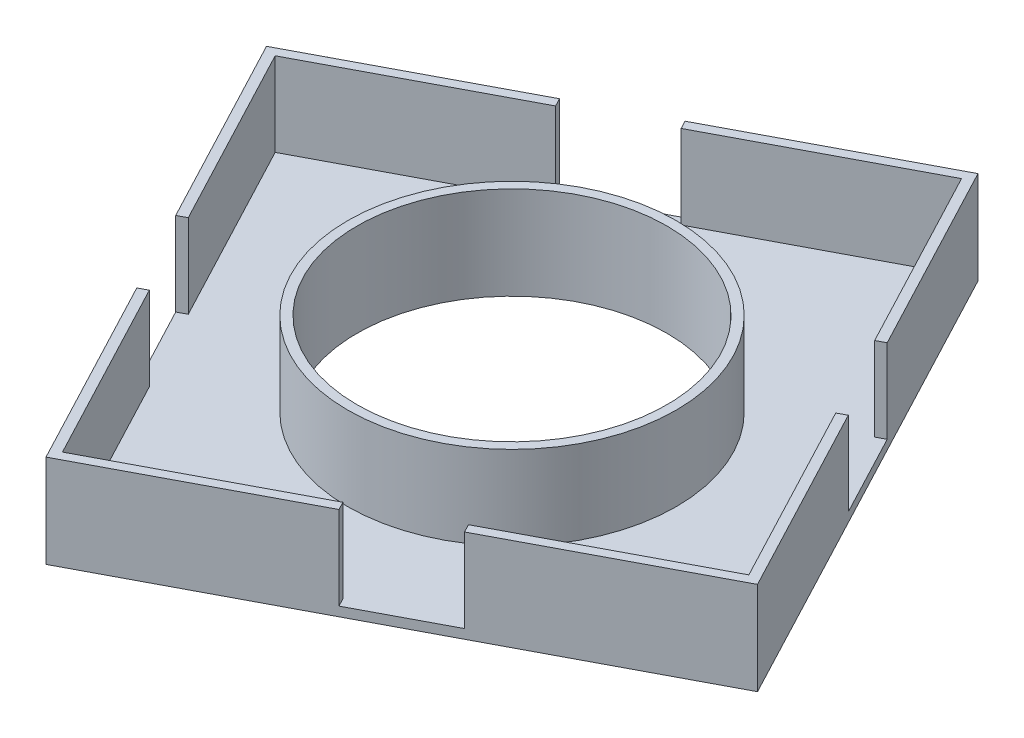
ISO-10303-21;
HEADER;
FILE_DESCRIPTION(('STEP AP214'),'2;1');
FILE_NAME('part.step','',(''),(''),'','','');
FILE_SCHEMA(('AUTOMOTIVE_DESIGN { 1 0 10303 214 1 1 1 1 }'));
ENDSEC;
DATA;
#1=APPLICATION_CONTEXT('core data for automotive mechanical design processes');
#2=APPLICATION_PROTOCOL_DEFINITION('international standard','automotive_design',2000,#1);
#3=PRODUCT_CONTEXT('',#1,'mechanical');
#4=PRODUCT('Part','Part','',(#3));
#5=PRODUCT_RELATED_PRODUCT_CATEGORY('part','',(#4));
#6=PRODUCT_DEFINITION_FORMATION('','',#4);
#7=PRODUCT_DEFINITION_CONTEXT('part definition',#1,'design');
#8=PRODUCT_DEFINITION('design','',#6,#7);
#9=PRODUCT_DEFINITION_SHAPE('','',#8);
#10=(LENGTH_UNIT() NAMED_UNIT(*) SI_UNIT(.MILLI.,.METRE.));
#11=(NAMED_UNIT(*) PLANE_ANGLE_UNIT() SI_UNIT($,.RADIAN.));
#12=(NAMED_UNIT(*) SI_UNIT($,.STERADIAN.) SOLID_ANGLE_UNIT());
#13=UNCERTAINTY_MEASURE_WITH_UNIT(LENGTH_MEASURE(1.E-05),#10,'distance_accuracy_value','');
#14=(GEOMETRIC_REPRESENTATION_CONTEXT(3) GLOBAL_UNCERTAINTY_ASSIGNED_CONTEXT((#13)) GLOBAL_UNIT_ASSIGNED_CONTEXT((#10,
#11,#12)) REPRESENTATION_CONTEXT('',''));
#15=CARTESIAN_POINT('',(0.,0.,0.));
#16=DIRECTION('',(0.,0.,1.));
#17=DIRECTION('',(1.,0.,0.));
#18=AXIS2_PLACEMENT_3D('',#15,#16,#17);
#19=CARTESIAN_POINT('',(0.,30.,0.));
#20=DIRECTION('',(0.,1.,0.));
#21=DIRECTION('',(0.,0.,1.));
#22=AXIS2_PLACEMENT_3D('',#19,#20,#21);
#23=PLANE('',#22);
#24=DIRECTION('',(0.466105526210317,0.,0.884729132806309));
#25=VECTOR('',#24,1.);
#26=CARTESIAN_POINT('',(24.9497161571522,30.,79.539371783273));
#27=LINE('',#26,#25);
#28=CARTESIAN_POINT('',(24.9497161571522,30.,79.539371783273));
#29=VERTEX_POINT('',#28);
#30=CARTESIAN_POINT('',(26.3480327357832,30.,82.193559181692));
#31=VERTEX_POINT('',#30);
#32=EDGE_CURVE('E212',#29,#31,#27,.T.);
#33=ORIENTED_EDGE('',*,*,#32,.F.);
#34=DIRECTION('',(0.884729132806305,0.,-0.466105526210324));
#35=VECTOR('',#34,1.);
#36=CARTESIAN_POINT('',(-36.9813231392899,30.,112.166758617996));
#37=LINE('',#36,#35);
#38=CARTESIAN_POINT('',(-34.327135740871,30.,110.768442039365));
#39=VERTEX_POINT('',#38);
#40=EDGE_CURVE('E332',#39,#29,#37,.T.);
#41=ORIENTED_EDGE('',*,*,#40,.F.);
#42=DIRECTION('',(0.466105526210324,0.,0.884729132806305));
#43=VECTOR('',#42,1.);
#44=CARTESIAN_POINT('',(-112.166758617996,30.,-36.9813231392899));
#45=LINE('',#44,#43);
#46=CARTESIAN_POINT('',(-65.5562059969636,30.,51.4915901413412));
#47=VERTEX_POINT('',#46);
#48=EDGE_CURVE('E344',#47,#39,#45,.T.);
#49=ORIENTED_EDGE('',*,*,#48,.F.);
#50=DIRECTION('',(0.88472913280631,0.,-0.466105526210316));
#51=VECTOR('',#50,1.);
#52=CARTESIAN_POINT('',(-68.2103933953825,30.,52.8899067199722));
#53=LINE('',#52,#51);
#54=CARTESIAN_POINT('',(-68.2103933953825,30.,52.8899067199722));
#55=VERTEX_POINT('',#54);
#56=EDGE_CURVE('E250',#55,#47,#53,.T.);
#57=ORIENTED_EDGE('',*,*,#56,.F.);
#58=DIRECTION('',(0.466105526210324,0.,0.884729132806305));
#59=VECTOR('',#58,1.);
#60=CARTESIAN_POINT('',(-114.820946016415,30.,-35.5830065606589));
#61=LINE('',#60,#59);
#62=CARTESIAN_POINT('',(-35.5830065606589,30.,114.820946016415));
#63=VERTEX_POINT('',#62);
#64=EDGE_CURVE('E367',#55,#63,#61,.T.);
#65=ORIENTED_EDGE('',*,*,#64,.T.);
#66=DIRECTION('',(0.884729132806305,0.,-0.466105526210324));
#67=VECTOR('',#66,1.);
#68=CARTESIAN_POINT('',(-35.5830065606589,30.,114.820946016415));
#69=LINE('',#68,#67);
#70=EDGE_CURVE('E372',#63,#31,#69,.T.);
#71=ORIENTED_EDGE('',*,*,#70,.T.);
#72=EDGE_LOOP('',(#33,#41,#49,#57,#65,#71));
#73=FACE_BOUND('',#72,.T.);
#74=ADVANCED_FACE('F47',(#73),#23,.T.);
#75=DIRECTION('',(-0.884729132806309,0.,0.466105526210317));
#76=VECTOR('',#75,1.);
#77=CARTESIAN_POINT('',(-79.5393717832731,30.,24.949716157152));
#78=LINE('',#77,#76);
#79=CARTESIAN_POINT('',(-79.5393717832731,30.,24.949716157152));
#80=VERTEX_POINT('',#79);
#81=CARTESIAN_POINT('',(-82.193559181692,30.,26.3480327357829));
#82=VERTEX_POINT('',#81);
#83=EDGE_CURVE('E254',#80,#82,#78,.T.);
#84=ORIENTED_EDGE('',*,*,#83,.F.);
#85=CARTESIAN_POINT('',(-110.768442039365,30.,-34.327135740871));
#86=VERTEX_POINT('',#85);
#87=EDGE_CURVE('E345',#86,#80,#45,.T.);
#88=ORIENTED_EDGE('',*,*,#87,.F.);
#89=DIRECTION('',(-0.884729132806305,0.,0.466105526210324));
#90=VECTOR('',#89,1.);
#91=CARTESIAN_POINT('',(36.9813231392899,30.,-112.166758617996));
#92=LINE('',#91,#90);
#93=CARTESIAN_POINT('',(-51.491590141341,30.,-65.5562059969637));
#94=VERTEX_POINT('',#93);
#95=EDGE_CURVE('E340',#94,#86,#92,.T.);
#96=ORIENTED_EDGE('',*,*,#95,.F.);
#97=DIRECTION('',(0.466105526210314,0.,0.88472913280631));
#98=VECTOR('',#97,1.);
#99=CARTESIAN_POINT('',(-52.8899067199719,30.,-68.2103933953827));
#100=LINE('',#99,#98);
#101=CARTESIAN_POINT('',(-52.8899067199719,30.,-68.2103933953827));
#102=VERTEX_POINT('',#101);
#103=EDGE_CURVE('E270',#102,#94,#100,.T.);
#104=ORIENTED_EDGE('',*,*,#103,.F.);
#105=DIRECTION('',(-0.884729132806305,0.,0.466105526210324));
#106=VECTOR('',#105,1.);
#107=CARTESIAN_POINT('',(35.5830065606589,30.,-114.820946016415));
#108=LINE('',#107,#106);
#109=CARTESIAN_POINT('',(-114.820946016415,30.,-35.5830065606589));
#110=VERTEX_POINT('',#109);
#111=EDGE_CURVE('E362',#102,#110,#108,.T.);
#112=ORIENTED_EDGE('',*,*,#111,.T.);
#113=EDGE_CURVE('E368',#110,#82,#61,.T.);
#114=ORIENTED_EDGE('',*,*,#113,.T.);
#115=EDGE_LOOP('',(#84,#88,#96,#104,#112,#114));
#116=FACE_BOUND('',#115,.T.);
#117=ADVANCED_FACE('F439',(#116),#23,.T.);
#118=DIRECTION('',(-0.466105526210312,0.,-0.884729132806312));
#119=VECTOR('',#118,1.);
#120=CARTESIAN_POINT('',(-24.9497161571517,30.,-79.5393717832732));
#121=LINE('',#120,#119);
#122=CARTESIAN_POINT('',(-24.9497161571517,30.,-79.5393717832732));
#123=VERTEX_POINT('',#122);
#124=CARTESIAN_POINT('',(-26.3480327357826,30.,-82.1935591816921));
#125=VERTEX_POINT('',#124);
#126=EDGE_CURVE('E274',#123,#125,#121,.T.);
#127=ORIENTED_EDGE('',*,*,#126,.F.);
#128=CARTESIAN_POINT('',(34.3271357408709,30.,-110.768442039365));
#129=VERTEX_POINT('',#128);
#130=EDGE_CURVE('E341',#129,#123,#92,.T.);
#131=ORIENTED_EDGE('',*,*,#130,.F.);
#132=DIRECTION('',(-0.466105526210324,0.,-0.884729132806305));
#133=VECTOR('',#132,1.);
#134=CARTESIAN_POINT('',(112.166758617996,30.,36.9813231392899));
#135=LINE('',#134,#133);
#136=CARTESIAN_POINT('',(65.5562059969632,30.,-51.4915901413417));
#137=VERTEX_POINT('',#136);
#138=EDGE_CURVE('E311',#137,#129,#135,.T.);
#139=ORIENTED_EDGE('',*,*,#138,.F.);
#140=DIRECTION('',(-0.884729132806306,0.,0.466105526210323));
#141=VECTOR('',#140,1.);
#142=CARTESIAN_POINT('',(68.2103933953821,30.,-52.8899067199726));
#143=LINE('',#142,#141);
#144=CARTESIAN_POINT('',(68.2103933953821,30.,-52.8899067199726));
#145=VERTEX_POINT('',#144);
#146=EDGE_CURVE('E289',#145,#137,#143,.T.);
#147=ORIENTED_EDGE('',*,*,#146,.F.);
#148=DIRECTION('',(-0.466105526210324,0.,-0.884729132806305));
#149=VECTOR('',#148,1.);
#150=CARTESIAN_POINT('',(114.820946016415,30.,35.5830065606589));
#151=LINE('',#150,#149);
#152=CARTESIAN_POINT('',(35.5830065606589,30.,-114.820946016415));
#153=VERTEX_POINT('',#152);
#154=EDGE_CURVE('E363',#145,#153,#151,.T.);
#155=ORIENTED_EDGE('',*,*,#154,.T.);
#156=EDGE_CURVE('E364',#153,#125,#108,.T.);
#157=ORIENTED_EDGE('',*,*,#156,.T.);
#158=EDGE_LOOP('',(#127,#131,#139,#147,#155,#157));
#159=FACE_BOUND('',#158,.T.);
#160=ADVANCED_FACE('F446',(#159),#23,.T.);
#161=CARTESIAN_POINT('',(36.9813231392899,30.,-112.166758617996));
#162=DIRECTION('',(0.466105526210324,0.,0.884729132806305));
#163=DIRECTION('',(0.884729132806305,0.,-0.466105526210324));
#164=AXIS2_PLACEMENT_3D('',#161,#162,#163);
#165=PLANE('',#164);
#166=DIRECTION('',(0.,1.,0.));
#167=VECTOR('',#166,1.);
#168=CARTESIAN_POINT('',(-24.9497161571517,3.,-79.5393717832732));
#169=LINE('',#168,#167);
#170=CARTESIAN_POINT('',(-24.9497161571517,3.,-79.5393717832732));
#171=VERTEX_POINT('',#170);
#172=EDGE_CURVE('E256',#171,#123,#169,.T.);
#173=ORIENTED_EDGE('',*,*,#172,.F.);
#174=DIRECTION('',(-0.884729132806305,0.,0.466105526210324));
#175=VECTOR('',#174,1.);
#176=CARTESIAN_POINT('',(36.9813231392899,3.,-112.166758617996));
#177=LINE('',#176,#175);
#178=CARTESIAN_POINT('',(34.3271357408709,3.,-110.768442039365));
#179=VERTEX_POINT('',#178);
#180=EDGE_CURVE('E317',#179,#171,#177,.T.);
#181=ORIENTED_EDGE('',*,*,#180,.F.);
#182=DIRECTION('',(0.,-1.,0.));
#183=VECTOR('',#182,1.);
#184=CARTESIAN_POINT('',(34.3271357408709,30.,-110.768442039365));
#185=LINE('',#184,#183);
#186=EDGE_CURVE('E323',#129,#179,#185,.T.);
#187=ORIENTED_EDGE('',*,*,#186,.F.);
#188=ORIENTED_EDGE('',*,*,#130,.T.);
#189=EDGE_LOOP('',(#173,#181,#187,#188));
#190=FACE_BOUND('',#189,.T.);
#191=ADVANCED_FACE('F502',(#190),#165,.T.);
#192=CARTESIAN_POINT('',(-112.166758617996,30.,-36.9813231392899));
#193=DIRECTION('',(0.884729132806305,0.,-0.466105526210324));
#194=DIRECTION('',(-0.466105526210324,0.,-0.884729132806305));
#195=AXIS2_PLACEMENT_3D('',#192,#193,#194);
#196=PLANE('',#195);
#197=DIRECTION('',(0.,1.,0.));
#198=VECTOR('',#197,1.);
#199=CARTESIAN_POINT('',(-79.5393717832731,3.,24.949716157152));
#200=LINE('',#199,#198);
#201=CARTESIAN_POINT('',(-79.5393717832731,3.,24.949716157152));
#202=VERTEX_POINT('',#201);
#203=EDGE_CURVE('E237',#202,#80,#200,.T.);
#204=ORIENTED_EDGE('',*,*,#203,.F.);
#205=DIRECTION('',(0.466105526210324,0.,0.884729132806305));
#206=VECTOR('',#205,1.);
#207=CARTESIAN_POINT('',(-112.166758617996,3.,-36.9813231392899));
#208=LINE('',#207,#206);
#209=CARTESIAN_POINT('',(-110.768442039365,3.,-34.327135740871));
#210=VERTEX_POINT('',#209);
#211=EDGE_CURVE('E313',#210,#202,#208,.T.);
#212=ORIENTED_EDGE('',*,*,#211,.F.);
#213=DIRECTION('',(0.,-1.,0.));
#214=VECTOR('',#213,1.);
#215=CARTESIAN_POINT('',(-110.768442039365,30.,-34.327135740871));
#216=LINE('',#215,#214);
#217=EDGE_CURVE('E327',#86,#210,#216,.T.);
#218=ORIENTED_EDGE('',*,*,#217,.F.);
#219=ORIENTED_EDGE('',*,*,#87,.T.);
#220=EDGE_LOOP('',(#204,#212,#218,#219));
#221=FACE_BOUND('',#220,.T.);
#222=ADVANCED_FACE('F523',(#221),#196,.T.);
#223=CARTESIAN_POINT('',(-36.9813231392899,30.,112.166758617996));
#224=DIRECTION('',(-0.466105526210324,0.,-0.884729132806305));
#225=DIRECTION('',(-0.884729132806305,0.,0.466105526210324));
#226=AXIS2_PLACEMENT_3D('',#223,#224,#225);
#227=PLANE('',#226);
#228=DIRECTION('',(0.,1.,0.));
#229=VECTOR('',#228,1.);
#230=CARTESIAN_POINT('',(24.9497161571522,3.,79.539371783273));
#231=LINE('',#230,#229);
#232=CARTESIAN_POINT('',(24.9497161571522,3.,79.539371783273));
#233=VERTEX_POINT('',#232);
#234=EDGE_CURVE('E239',#233,#29,#231,.T.);
#235=ORIENTED_EDGE('',*,*,#234,.F.);
#236=DIRECTION('',(0.884729132806305,0.,-0.466105526210324));
#237=VECTOR('',#236,1.);
#238=CARTESIAN_POINT('',(-36.9813231392899,3.,112.166758617996));
#239=LINE('',#238,#237);
#240=CARTESIAN_POINT('',(-34.327135740871,3.,110.768442039365));
#241=VERTEX_POINT('',#240);
#242=EDGE_CURVE('E228',#241,#233,#239,.T.);
#243=ORIENTED_EDGE('',*,*,#242,.F.);
#244=DIRECTION('',(0.,-1.,0.));
#245=VECTOR('',#244,1.);
#246=CARTESIAN_POINT('',(-34.327135740871,30.,110.768442039365));
#247=LINE('',#246,#245);
#248=EDGE_CURVE('E331',#39,#241,#247,.T.);
#249=ORIENTED_EDGE('',*,*,#248,.F.);
#250=ORIENTED_EDGE('',*,*,#40,.T.);
#251=EDGE_LOOP('',(#235,#243,#249,#250));
#252=FACE_BOUND('',#251,.T.);
#253=ADVANCED_FACE('F542',(#252),#227,.T.);
#254=CARTESIAN_POINT('',(112.166758617996,30.,36.9813231392899));
#255=DIRECTION('',(-0.884729132806305,0.,0.466105526210324));
#256=DIRECTION('',(0.466105526210324,0.,0.884729132806305));
#257=AXIS2_PLACEMENT_3D('',#254,#255,#256);
#258=PLANE('',#257);
#259=DIRECTION('',(0.,1.,0.));
#260=VECTOR('',#259,1.);
#261=CARTESIAN_POINT('',(65.5562059969632,3.,-51.4915901413417));
#262=LINE('',#261,#260);
#263=CARTESIAN_POINT('',(65.5562059969632,3.,-51.4915901413417));
#264=VERTEX_POINT('',#263);
#265=EDGE_CURVE('E296',#264,#137,#262,.T.);
#266=ORIENTED_EDGE('',*,*,#265,.T.);
#267=ORIENTED_EDGE('',*,*,#138,.T.);
#268=ORIENTED_EDGE('',*,*,#186,.T.);
#269=DIRECTION('',(-0.466105526210324,0.,-0.884729132806305));
#270=VECTOR('',#269,1.);
#271=CARTESIAN_POINT('',(112.166758617996,3.,36.9813231392899));
#272=LINE('',#271,#270);
#273=EDGE_CURVE('E309',#264,#179,#272,.T.);
#274=ORIENTED_EDGE('',*,*,#273,.F.);
#275=EDGE_LOOP('',(#266,#267,#268,#274));
#276=FACE_BOUND('',#275,.T.);
#277=ADVANCED_FACE('F460',(#276),#258,.T.);
#278=CARTESIAN_POINT('',(0.,30.,0.));
#279=DIRECTION('',(0.,1.,0.));
#280=DIRECTION('',(0.,0.,1.));
#281=AXIS2_PLACEMENT_3D('',#278,#279,#280);
#282=CIRCLE('',#281,50.);
#283=CARTESIAN_POINT('',(0.,30.,50.));
#284=VERTEX_POINT('',#283);
#285=EDGE_CURVE('E353',#284,#284,#282,.T.);
#286=ORIENTED_EDGE('',*,*,#285,.F.);
#287=EDGE_LOOP('',(#286));
#288=FACE_BOUND('',#287,.T.);
#289=CARTESIAN_POINT('',(0.,30.,0.));
#290=DIRECTION('',(0.,1.,0.));
#291=DIRECTION('',(0.,0.,1.));
#292=AXIS2_PLACEMENT_3D('',#289,#290,#291);
#293=CIRCLE('',#292,53.);
#294=CARTESIAN_POINT('',(0.,30.,53.));
#295=VERTEX_POINT('',#294);
#296=EDGE_CURVE('E322',#295,#295,#293,.T.);
#297=ORIENTED_EDGE('',*,*,#296,.T.);
#298=EDGE_LOOP('',(#297));
#299=FACE_BOUND('',#298,.T.);
#300=ADVANCED_FACE('F452',(#288,#299),#23,.T.);
#301=DIRECTION('',(-0.466105526210321,0.,-0.884729132806307));
#302=VECTOR('',#301,1.);
#303=CARTESIAN_POINT('',(52.8899067199724,30.,68.2103933953823));
#304=LINE('',#303,#302);
#305=CARTESIAN_POINT('',(52.8899067199724,30.,68.2103933953823));
#306=VERTEX_POINT('',#305);
#307=CARTESIAN_POINT('',(51.4915901413414,30.,65.5562059969634));
#308=VERTEX_POINT('',#307);
#309=EDGE_CURVE('E229',#306,#308,#304,.T.);
#310=ORIENTED_EDGE('',*,*,#309,.F.);
#311=CARTESIAN_POINT('',(114.820946016415,30.,35.5830065606589));
#312=VERTEX_POINT('',#311);
#313=EDGE_CURVE('E371',#306,#312,#69,.T.);
#314=ORIENTED_EDGE('',*,*,#313,.T.);
#315=CARTESIAN_POINT('',(82.1935591816919,30.,-26.3480327357835));
#316=VERTEX_POINT('',#315);
#317=EDGE_CURVE('E359',#312,#316,#151,.T.);
#318=ORIENTED_EDGE('',*,*,#317,.T.);
#319=DIRECTION('',(0.884729132806307,0.,-0.466105526210321));
#320=VECTOR('',#319,1.);
#321=CARTESIAN_POINT('',(79.5393717832729,30.,-24.9497161571525));
#322=LINE('',#321,#320);
#323=CARTESIAN_POINT('',(79.5393717832729,30.,-24.9497161571525));
#324=VERTEX_POINT('',#323);
#325=EDGE_CURVE('E241',#324,#316,#322,.T.);
#326=ORIENTED_EDGE('',*,*,#325,.F.);
#327=CARTESIAN_POINT('',(110.768442039365,30.,34.327135740871));
#328=VERTEX_POINT('',#327);
#329=EDGE_CURVE('E337',#328,#324,#135,.T.);
#330=ORIENTED_EDGE('',*,*,#329,.F.);
#331=EDGE_CURVE('E348',#308,#328,#37,.T.);
#332=ORIENTED_EDGE('',*,*,#331,.F.);
#333=EDGE_LOOP('',(#310,#314,#318,#326,#330,#332));
#334=FACE_BOUND('',#333,.T.);
#335=ADVANCED_FACE('F442',(#334),#23,.T.);
#336=CARTESIAN_POINT('',(0.,0.,0.));
#337=DIRECTION('',(0.,1.,0.));
#338=DIRECTION('',(0.,0.,1.));
#339=AXIS2_PLACEMENT_3D('',#336,#337,#338);
#340=PLANE('',#339);
#341=CARTESIAN_POINT('',(-23.6809272791058,0.,76.4147478121996));
#342=DIRECTION('',(0.,1.,0.));
#343=DIRECTION('',(0.,0.,1.));
#344=AXIS2_PLACEMENT_3D('',#341,#342,#343);
#345=CIRCLE('',#344,3.99999999999778);
#346=CARTESIAN_POINT('',(-23.6809272791058,0.,80.4147478121973));
#347=VERTEX_POINT('',#346);
#348=EDGE_CURVE('E409',#347,#347,#345,.T.);
#349=ORIENTED_EDGE('',*,*,#348,.T.);
#350=EDGE_LOOP('',(#349));
#351=FACE_BOUND('',#350,.T.);
#352=CARTESIAN_POINT('',(76.4147478121968,0.,23.6809272791073));
#353=DIRECTION('',(0.,1.,0.));
#354=DIRECTION('',(0.,0.,1.));
#355=AXIS2_PLACEMENT_3D('',#352,#353,#354);
#356=CIRCLE('',#355,3.99999999999998);
#357=CARTESIAN_POINT('',(76.4147478121968,0.,27.6809272791072));
#358=VERTEX_POINT('',#357);
#359=EDGE_CURVE('E406',#358,#358,#356,.T.);
#360=ORIENTED_EDGE('',*,*,#359,.T.);
#361=EDGE_LOOP('',(#360));
#362=FACE_BOUND('',#361,.T.);
#363=CARTESIAN_POINT('',(-76.4147478121981,0.,-23.680927279103));
#364=DIRECTION('',(0.,1.,0.));
#365=DIRECTION('',(0.,0.,1.));
#366=AXIS2_PLACEMENT_3D('',#363,#364,#365);
#367=CIRCLE('',#366,4.);
#368=CARTESIAN_POINT('',(-76.4147478121981,0.,-19.680927279103));
#369=VERTEX_POINT('',#368);
#370=EDGE_CURVE('E403',#369,#369,#367,.T.);
#371=ORIENTED_EDGE('',*,*,#370,.T.);
#372=EDGE_LOOP('',(#371));
#373=FACE_BOUND('',#372,.T.);
#374=CARTESIAN_POINT('',(23.6809272791045,0.,-76.4147478121953));
#375=DIRECTION('',(0.,1.,0.));
#376=DIRECTION('',(0.,0.,1.));
#377=AXIS2_PLACEMENT_3D('',#374,#375,#376);
#378=CIRCLE('',#377,4.00000000000219);
#379=CARTESIAN_POINT('',(23.6809272791045,0.,-72.4147478121932));
#380=VERTEX_POINT('',#379);
#381=EDGE_CURVE('E400',#380,#380,#378,.T.);
#382=ORIENTED_EDGE('',*,*,#381,.T.);
#383=EDGE_LOOP('',(#382));
#384=FACE_BOUND('',#383,.T.);
#385=DIRECTION('',(-0.466105526210324,0.,-0.884729132806305));
#386=VECTOR('',#385,1.);
#387=CARTESIAN_POINT('',(114.820946016415,0.,35.5830065606589));
#388=LINE('',#387,#386);
#389=CARTESIAN_POINT('',(114.820946016415,0.,35.5830065606589));
#390=VERTEX_POINT('',#389);
#391=CARTESIAN_POINT('',(35.5830065606589,0.,-114.820946016415));
#392=VERTEX_POINT('',#391);
#393=EDGE_CURVE('E356',#390,#392,#388,.T.);
#394=ORIENTED_EDGE('',*,*,#393,.F.);
#395=DIRECTION('',(0.884729132806305,0.,-0.466105526210324));
#396=VECTOR('',#395,1.);
#397=CARTESIAN_POINT('',(-35.5830065606589,0.,114.820946016415));
#398=LINE('',#397,#396);
#399=CARTESIAN_POINT('',(-35.5830065606589,0.,114.820946016415));
#400=VERTEX_POINT('',#399);
#401=EDGE_CURVE('E381',#400,#390,#398,.T.);
#402=ORIENTED_EDGE('',*,*,#401,.F.);
#403=DIRECTION('',(0.466105526210324,0.,0.884729132806305));
#404=VECTOR('',#403,1.);
#405=CARTESIAN_POINT('',(-114.820946016415,0.,-35.5830065606589));
#406=LINE('',#405,#404);
#407=CARTESIAN_POINT('',(-114.820946016415,0.,-35.5830065606589));
#408=VERTEX_POINT('',#407);
#409=EDGE_CURVE('E379',#408,#400,#406,.T.);
#410=ORIENTED_EDGE('',*,*,#409,.F.);
#411=DIRECTION('',(-0.884729132806305,0.,0.466105526210324));
#412=VECTOR('',#411,1.);
#413=CARTESIAN_POINT('',(35.5830065606589,0.,-114.820946016415));
#414=LINE('',#413,#412);
#415=EDGE_CURVE('E377',#392,#408,#414,.T.);
#416=ORIENTED_EDGE('',*,*,#415,.F.);
#417=EDGE_LOOP('',(#394,#402,#410,#416));
#418=FACE_BOUND('',#417,.T.);
#419=CARTESIAN_POINT('',(0.,0.,0.));
#420=DIRECTION('',(0.,1.,0.));
#421=DIRECTION('',(0.,0.,1.));
#422=AXIS2_PLACEMENT_3D('',#419,#420,#421);
#423=CIRCLE('',#422,50.);
#424=CARTESIAN_POINT('',(0.,0.,50.));
#425=VERTEX_POINT('',#424);
#426=EDGE_CURVE('E326',#425,#425,#423,.T.);
#427=ORIENTED_EDGE('',*,*,#426,.T.);
#428=EDGE_LOOP('',(#427));
#429=FACE_BOUND('',#428,.T.);
#430=ADVANCED_FACE('F451',(#351,#362,#373,#384,#418,#429),#340,.F.);
#431=CARTESIAN_POINT('',(114.820946016415,30.,35.5830065606589));
#432=DIRECTION('',(-0.884729132806305,0.,0.466105526210324));
#433=DIRECTION('',(0.466105526210324,0.,0.884729132806305));
#434=AXIS2_PLACEMENT_3D('',#431,#432,#433);
#435=PLANE('',#434);
#436=ORIENTED_EDGE('',*,*,#154,.F.);
#437=DIRECTION('',(0.,1.,0.));
#438=VECTOR('',#437,1.);
#439=CARTESIAN_POINT('',(68.2103933953821,3.,-52.8899067199726));
#440=LINE('',#439,#438);
#441=CARTESIAN_POINT('',(68.2103933953821,3.,-52.8899067199726));
#442=VERTEX_POINT('',#441);
#443=EDGE_CURVE('E300',#442,#145,#440,.T.);
#444=ORIENTED_EDGE('',*,*,#443,.F.);
#445=DIRECTION('',(-0.466105526210324,0.,-0.884729132806305));
#446=VECTOR('',#445,1.);
#447=CARTESIAN_POINT('',(82.1935591816919,3.,-26.3480327357835));
#448=LINE('',#447,#446);
#449=CARTESIAN_POINT('',(82.1935591816919,3.,-26.3480327357835));
#450=VERTEX_POINT('',#449);
#451=EDGE_CURVE('E288',#450,#442,#448,.T.);
#452=ORIENTED_EDGE('',*,*,#451,.F.);
#453=DIRECTION('',(0.,1.,0.));
#454=VECTOR('',#453,1.);
#455=CARTESIAN_POINT('',(82.1935591816919,3.,-26.3480327357835));
#456=LINE('',#455,#454);
#457=EDGE_CURVE('E302',#450,#316,#456,.T.);
#458=ORIENTED_EDGE('',*,*,#457,.T.);
#459=ORIENTED_EDGE('',*,*,#317,.F.);
#460=DIRECTION('',(0.,-1.,0.));
#461=VECTOR('',#460,1.);
#462=CARTESIAN_POINT('',(114.820946016415,30.,35.5830065606589));
#463=LINE('',#462,#461);
#464=EDGE_CURVE('E374',#312,#390,#463,.T.);
#465=ORIENTED_EDGE('',*,*,#464,.T.);
#466=ORIENTED_EDGE('',*,*,#393,.T.);
#467=DIRECTION('',(0.,-1.,0.));
#468=VECTOR('',#467,1.);
#469=CARTESIAN_POINT('',(35.5830065606589,30.,-114.820946016415));
#470=LINE('',#469,#468);
#471=EDGE_CURVE('E391',#153,#392,#470,.T.);
#472=ORIENTED_EDGE('',*,*,#471,.F.);
#473=EDGE_LOOP('',(#436,#444,#452,#458,#459,#465,#466,#472));
#474=FACE_BOUND('',#473,.T.);
#475=ADVANCED_FACE('F458',(#474),#435,.F.);
#476=CARTESIAN_POINT('',(35.5830065606589,30.,-114.820946016415));
#477=DIRECTION('',(0.466105526210324,0.,0.884729132806305));
#478=DIRECTION('',(0.884729132806305,0.,-0.466105526210324));
#479=AXIS2_PLACEMENT_3D('',#476,#477,#478);
#480=PLANE('',#479);
#481=DIRECTION('',(-0.88472913280631,0.,0.466105526210315));
#482=VECTOR('',#481,1.);
#483=CARTESIAN_POINT('',(-26.3480327357826,3.,-82.1935591816921));
#484=LINE('',#483,#482);
#485=CARTESIAN_POINT('',(-26.3480327357826,3.,-82.1935591816921));
#486=VERTEX_POINT('',#485);
#487=CARTESIAN_POINT('',(-52.8899067199719,3.,-68.2103933953827));
#488=VERTEX_POINT('',#487);
#489=EDGE_CURVE('E269',#486,#488,#484,.T.);
#490=ORIENTED_EDGE('',*,*,#489,.F.);
#491=DIRECTION('',(0.,1.,0.));
#492=VECTOR('',#491,1.);
#493=CARTESIAN_POINT('',(-26.3480327357826,3.,-82.1935591816921));
#494=LINE('',#493,#492);
#495=EDGE_CURVE('E273',#486,#125,#494,.T.);
#496=ORIENTED_EDGE('',*,*,#495,.T.);
#497=ORIENTED_EDGE('',*,*,#156,.F.);
#498=ORIENTED_EDGE('',*,*,#471,.T.);
#499=ORIENTED_EDGE('',*,*,#415,.T.);
#500=DIRECTION('',(0.,-1.,0.));
#501=VECTOR('',#500,1.);
#502=CARTESIAN_POINT('',(-114.820946016415,30.,-35.5830065606589));
#503=LINE('',#502,#501);
#504=EDGE_CURVE('E388',#110,#408,#503,.T.);
#505=ORIENTED_EDGE('',*,*,#504,.F.);
#506=ORIENTED_EDGE('',*,*,#111,.F.);
#507=DIRECTION('',(0.,1.,0.));
#508=VECTOR('',#507,1.);
#509=CARTESIAN_POINT('',(-52.8899067199719,3.,-68.2103933953827));
#510=LINE('',#509,#508);
#511=EDGE_CURVE('E281',#488,#102,#510,.T.);
#512=ORIENTED_EDGE('',*,*,#511,.F.);
#513=EDGE_LOOP('',(#490,#496,#497,#498,#499,#505,#506,#512));
#514=FACE_BOUND('',#513,.T.);
#515=ADVANCED_FACE('F507',(#514),#480,.F.);
#516=CARTESIAN_POINT('',(-114.820946016415,30.,-35.5830065606589));
#517=DIRECTION('',(0.884729132806305,0.,-0.466105526210324));
#518=DIRECTION('',(-0.466105526210324,0.,-0.884729132806305));
#519=AXIS2_PLACEMENT_3D('',#516,#517,#518);
#520=PLANE('',#519);
#521=DIRECTION('',(0.466105526210318,0.,0.884729132806308));
#522=VECTOR('',#521,1.);
#523=CARTESIAN_POINT('',(-82.193559181692,3.,26.3480327357829));
#524=LINE('',#523,#522);
#525=CARTESIAN_POINT('',(-82.193559181692,3.,26.3480327357829));
#526=VERTEX_POINT('',#525);
#527=CARTESIAN_POINT('',(-68.2103933953825,3.,52.8899067199722));
#528=VERTEX_POINT('',#527);
#529=EDGE_CURVE('E249',#526,#528,#524,.T.);
#530=ORIENTED_EDGE('',*,*,#529,.F.);
#531=DIRECTION('',(0.,1.,0.));
#532=VECTOR('',#531,1.);
#533=CARTESIAN_POINT('',(-82.193559181692,3.,26.3480327357829));
#534=LINE('',#533,#532);
#535=EDGE_CURVE('E253',#526,#82,#534,.T.);
#536=ORIENTED_EDGE('',*,*,#535,.T.);
#537=ORIENTED_EDGE('',*,*,#113,.F.);
#538=ORIENTED_EDGE('',*,*,#504,.T.);
#539=ORIENTED_EDGE('',*,*,#409,.T.);
#540=DIRECTION('',(0.,-1.,0.));
#541=VECTOR('',#540,1.);
#542=CARTESIAN_POINT('',(-35.5830065606589,30.,114.820946016415));
#543=LINE('',#542,#541);
#544=EDGE_CURVE('E385',#63,#400,#543,.T.);
#545=ORIENTED_EDGE('',*,*,#544,.F.);
#546=ORIENTED_EDGE('',*,*,#64,.F.);
#547=DIRECTION('',(0.,1.,0.));
#548=VECTOR('',#547,1.);
#549=CARTESIAN_POINT('',(-68.2103933953825,3.,52.8899067199722));
#550=LINE('',#549,#548);
#551=EDGE_CURVE('E262',#528,#55,#550,.T.);
#552=ORIENTED_EDGE('',*,*,#551,.F.);
#553=EDGE_LOOP('',(#530,#536,#537,#538,#539,#545,#546,#552));
#554=FACE_BOUND('',#553,.T.);
#555=ADVANCED_FACE('F528',(#554),#520,.F.);
#556=CARTESIAN_POINT('',(-35.5830065606589,30.,114.820946016415));
#557=DIRECTION('',(-0.466105526210324,0.,-0.884729132806305));
#558=DIRECTION('',(-0.884729132806305,0.,0.466105526210324));
#559=AXIS2_PLACEMENT_3D('',#556,#557,#558);
#560=PLANE('',#559);
#561=DIRECTION('',(0.884729132806307,0.,-0.466105526210321));
#562=VECTOR('',#561,1.);
#563=CARTESIAN_POINT('',(26.3480327357832,3.,82.193559181692));
#564=LINE('',#563,#562);
#565=CARTESIAN_POINT('',(26.3480327357832,3.,82.193559181692));
#566=VERTEX_POINT('',#565);
#567=CARTESIAN_POINT('',(52.8899067199724,3.,68.2103933953823));
#568=VERTEX_POINT('',#567);
#569=EDGE_CURVE('E225',#566,#568,#564,.T.);
#570=ORIENTED_EDGE('',*,*,#569,.F.);
#571=DIRECTION('',(0.,1.,0.));
#572=VECTOR('',#571,1.);
#573=CARTESIAN_POINT('',(26.3480327357832,3.,82.193559181692));
#574=LINE('',#573,#572);
#575=EDGE_CURVE('E206',#566,#31,#574,.T.);
#576=ORIENTED_EDGE('',*,*,#575,.T.);
#577=ORIENTED_EDGE('',*,*,#70,.F.);
#578=ORIENTED_EDGE('',*,*,#544,.T.);
#579=ORIENTED_EDGE('',*,*,#401,.T.);
#580=ORIENTED_EDGE('',*,*,#464,.F.);
#581=ORIENTED_EDGE('',*,*,#313,.F.);
#582=DIRECTION('',(0.,1.,0.));
#583=VECTOR('',#582,1.);
#584=CARTESIAN_POINT('',(52.8899067199724,3.,68.2103933953823));
#585=LINE('',#584,#583);
#586=EDGE_CURVE('E217',#568,#306,#585,.T.);
#587=ORIENTED_EDGE('',*,*,#586,.F.);
#588=EDGE_LOOP('',(#570,#576,#577,#578,#579,#580,#581,#587));
#589=FACE_BOUND('',#588,.T.);
#590=ADVANCED_FACE('F231',(#589),#560,.F.);
#591=CARTESIAN_POINT('',(0.,30.,0.));
#592=DIRECTION('',(0.,-1.,0.));
#593=DIRECTION('',(0.,0.,-1.));
#594=AXIS2_PLACEMENT_3D('',#591,#592,#593);
#595=CYLINDRICAL_SURFACE('',#594,50.);
#596=ORIENTED_EDGE('',*,*,#285,.T.);
#597=EDGE_LOOP('',(#596));
#598=FACE_BOUND('',#597,.T.);
#599=ORIENTED_EDGE('',*,*,#426,.F.);
#600=EDGE_LOOP('',(#599));
#601=FACE_BOUND('',#600,.T.);
#602=ADVANCED_FACE('F589',(#598,#601),#595,.F.);
#603=CARTESIAN_POINT('',(-76.4147478121981,-20.,-23.680927279103));
#604=DIRECTION('',(0.,1.,0.));
#605=DIRECTION('',(0.,0.,1.));
#606=AXIS2_PLACEMENT_3D('',#603,#604,#605);
#607=CYLINDRICAL_SURFACE('',#606,2.);
#608=CARTESIAN_POINT('',(-76.4147478121981,-2.,-23.680927279103));
#609=DIRECTION('',(0.,1.,0.));
#610=DIRECTION('',(0.,0.,1.));
#611=AXIS2_PLACEMENT_3D('',#608,#609,#610);
#612=CIRCLE('',#611,2.);
#613=CARTESIAN_POINT('',(-76.4147478121981,-2.,-21.680927279103));
#614=VERTEX_POINT('',#613);
#615=EDGE_CURVE('E421',#614,#614,#612,.F.);
#616=ORIENTED_EDGE('',*,*,#615,.T.);
#617=EDGE_LOOP('',(#616));
#618=FACE_BOUND('',#617,.T.);
#619=CARTESIAN_POINT('',(-76.4147478121981,-18.,-23.680927279103));
#620=DIRECTION('',(0.,1.,0.));
#621=DIRECTION('',(0.,0.,1.));
#622=AXIS2_PLACEMENT_3D('',#619,#620,#621);
#623=CIRCLE('',#622,2.);
#624=CARTESIAN_POINT('',(-76.4147478121981,-18.,-21.680927279103));
#625=VERTEX_POINT('',#624);
#626=EDGE_CURVE('E418',#625,#625,#623,.T.);
#627=ORIENTED_EDGE('',*,*,#626,.T.);
#628=EDGE_LOOP('',(#627));
#629=FACE_BOUND('',#628,.T.);
#630=ADVANCED_FACE('F586',(#618,#629),#607,.T.);
#631=CARTESIAN_POINT('',(23.6809272791045,-20.,-76.4147478121953));
#632=DIRECTION('',(0.,1.,0.));
#633=DIRECTION('',(0.,0.,1.));
#634=AXIS2_PLACEMENT_3D('',#631,#632,#633);
#635=CYLINDRICAL_SURFACE('',#634,2.00000000000219);
#636=CARTESIAN_POINT('',(23.6809272791045,-2.,-76.4147478121953));
#637=DIRECTION('',(0.,1.,0.));
#638=DIRECTION('',(0.,0.,1.));
#639=AXIS2_PLACEMENT_3D('',#636,#637,#638);
#640=CIRCLE('',#639,2.00000000000219);
#641=CARTESIAN_POINT('',(23.6809272791045,-2.,-74.4147478121932));
#642=VERTEX_POINT('',#641);
#643=EDGE_CURVE('E12',#642,#642,#640,.F.);
#644=ORIENTED_EDGE('',*,*,#643,.T.);
#645=EDGE_LOOP('',(#644));
#646=FACE_BOUND('',#645,.T.);
#647=CARTESIAN_POINT('',(23.6809272791045,-18.,-76.4147478121953));
#648=DIRECTION('',(0.,1.,0.));
#649=DIRECTION('',(0.,0.,1.));
#650=AXIS2_PLACEMENT_3D('',#647,#648,#649);
#651=CIRCLE('',#650,2.00000000000219);
#652=CARTESIAN_POINT('',(23.6809272791045,-18.,-74.4147478121932));
#653=VERTEX_POINT('',#652);
#654=EDGE_CURVE('E55',#653,#653,#651,.T.);
#655=ORIENTED_EDGE('',*,*,#654,.T.);
#656=EDGE_LOOP('',(#655));
#657=FACE_BOUND('',#656,.T.);
#658=ADVANCED_FACE('F426',(#646,#657),#635,.T.);
#659=CARTESIAN_POINT('',(76.4147478121968,-20.,23.6809272791073));
#660=DIRECTION('',(0.,1.,0.));
#661=DIRECTION('',(0.,0.,1.));
#662=AXIS2_PLACEMENT_3D('',#659,#660,#661);
#663=CYLINDRICAL_SURFACE('',#662,1.99999999999998);
#664=CARTESIAN_POINT('',(76.4147478121968,-2.,23.6809272791073));
#665=DIRECTION('',(0.,1.,0.));
#666=DIRECTION('',(0.,0.,1.));
#667=AXIS2_PLACEMENT_3D('',#664,#665,#666);
#668=CIRCLE('',#667,1.99999999999998);
#669=CARTESIAN_POINT('',(76.4147478121968,-2.,25.6809272791072));
#670=VERTEX_POINT('',#669);
#671=EDGE_CURVE('E415',#670,#670,#668,.F.);
#672=ORIENTED_EDGE('',*,*,#671,.T.);
#673=EDGE_LOOP('',(#672));
#674=FACE_BOUND('',#673,.T.);
#675=CARTESIAN_POINT('',(76.4147478121968,-18.,23.6809272791073));
#676=DIRECTION('',(0.,1.,0.));
#677=DIRECTION('',(0.,0.,1.));
#678=AXIS2_PLACEMENT_3D('',#675,#676,#677);
#679=CIRCLE('',#678,1.99999999999998);
#680=CARTESIAN_POINT('',(76.4147478121968,-18.,25.6809272791072));
#681=VERTEX_POINT('',#680);
#682=EDGE_CURVE('E412',#681,#681,#679,.T.);
#683=ORIENTED_EDGE('',*,*,#682,.T.);
#684=EDGE_LOOP('',(#683));
#685=FACE_BOUND('',#684,.T.);
#686=ADVANCED_FACE('F579',(#674,#685),#663,.T.);
#687=CARTESIAN_POINT('',(-23.6809272791058,-20.,76.4147478121996));
#688=DIRECTION('',(0.,1.,0.));
#689=DIRECTION('',(0.,0.,1.));
#690=AXIS2_PLACEMENT_3D('',#687,#688,#689);
#691=CYLINDRICAL_SURFACE('',#690,1.99999999999778);
#692=CARTESIAN_POINT('',(-23.6809272791058,-2.,76.4147478121996));
#693=DIRECTION('',(0.,1.,0.));
#694=DIRECTION('',(0.,0.,1.));
#695=AXIS2_PLACEMENT_3D('',#692,#693,#694);
#696=CIRCLE('',#695,1.99999999999778);
#697=CARTESIAN_POINT('',(-23.6809272791058,-2.,78.4147478121973));
#698=VERTEX_POINT('',#697);
#699=EDGE_CURVE('E397',#698,#698,#696,.F.);
#700=ORIENTED_EDGE('',*,*,#699,.T.);
#701=EDGE_LOOP('',(#700));
#702=FACE_BOUND('',#701,.T.);
#703=CARTESIAN_POINT('',(-23.6809272791058,-18.,76.4147478121996));
#704=DIRECTION('',(0.,1.,0.));
#705=DIRECTION('',(0.,0.,1.));
#706=AXIS2_PLACEMENT_3D('',#703,#704,#705);
#707=CIRCLE('',#706,1.99999999999778);
#708=CARTESIAN_POINT('',(-23.6809272791058,-18.,78.4147478121973));
#709=VERTEX_POINT('',#708);
#710=EDGE_CURVE('E394',#709,#709,#707,.T.);
#711=ORIENTED_EDGE('',*,*,#710,.T.);
#712=EDGE_LOOP('',(#711));
#713=FACE_BOUND('',#712,.T.);
#714=ADVANCED_FACE('F575',(#702,#713),#691,.T.);
#715=CARTESIAN_POINT('',(-23.6809272791058,-2.,76.4147478121996));
#716=DIRECTION('',(0.,1.,0.));
#717=DIRECTION('',(0.,0.,1.));
#718=AXIS2_PLACEMENT_3D('',#715,#716,#717);
#719=TOROIDAL_SURFACE('',#718,3.99999999999778,2.);
#720=ORIENTED_EDGE('',*,*,#348,.F.);
#721=EDGE_LOOP('',(#720));
#722=FACE_BOUND('',#721,.T.);
#723=ORIENTED_EDGE('',*,*,#699,.F.);
#724=EDGE_LOOP('',(#723));
#725=FACE_BOUND('',#724,.T.);
#726=ADVANCED_FACE('F578',(#722,#725),#719,.F.);
#727=CARTESIAN_POINT('',(-23.6809272791058,-18.,76.4147478121996));
#728=DIRECTION('',(0.,-1.,0.));
#729=DIRECTION('',(0.,0.,-1.));
#730=AXIS2_PLACEMENT_3D('',#727,#728,#729);
#731=SPHERICAL_SURFACE('',#730,2.);
#732=ORIENTED_EDGE('',*,*,#710,.F.);
#733=EDGE_LOOP('',(#732));
#734=FACE_BOUND('',#733,.T.);
#735=ADVANCED_FACE('F615',(#734),#731,.T.);
#736=CARTESIAN_POINT('',(76.4147478121968,-2.,23.6809272791073));
#737=DIRECTION('',(0.,1.,0.));
#738=DIRECTION('',(0.,0.,1.));
#739=AXIS2_PLACEMENT_3D('',#736,#737,#738);
#740=TOROIDAL_SURFACE('',#739,3.99999999999998,2.);
#741=ORIENTED_EDGE('',*,*,#359,.F.);
#742=EDGE_LOOP('',(#741));
#743=FACE_BOUND('',#742,.T.);
#744=ORIENTED_EDGE('',*,*,#671,.F.);
#745=EDGE_LOOP('',(#744));
#746=FACE_BOUND('',#745,.T.);
#747=ADVANCED_FACE('F619',(#743,#746),#740,.F.);
#748=CARTESIAN_POINT('',(76.4147478121968,-18.,23.6809272791073));
#749=DIRECTION('',(0.,-1.,0.));
#750=DIRECTION('',(0.,0.,-1.));
#751=AXIS2_PLACEMENT_3D('',#748,#749,#750);
#752=SPHERICAL_SURFACE('',#751,2.);
#753=ORIENTED_EDGE('',*,*,#682,.F.);
#754=EDGE_LOOP('',(#753));
#755=FACE_BOUND('',#754,.T.);
#756=ADVANCED_FACE('F623',(#755),#752,.T.);
#757=CARTESIAN_POINT('',(-76.4147478121981,-2.,-23.680927279103));
#758=DIRECTION('',(0.,1.,0.));
#759=DIRECTION('',(0.,0.,1.));
#760=AXIS2_PLACEMENT_3D('',#757,#758,#759);
#761=TOROIDAL_SURFACE('',#760,4.,2.);
#762=ORIENTED_EDGE('',*,*,#370,.F.);
#763=EDGE_LOOP('',(#762));
#764=FACE_BOUND('',#763,.T.);
#765=ORIENTED_EDGE('',*,*,#615,.F.);
#766=EDGE_LOOP('',(#765));
#767=FACE_BOUND('',#766,.T.);
#768=ADVANCED_FACE('F627',(#764,#767),#761,.F.);
#769=CARTESIAN_POINT('',(-76.4147478121981,-18.,-23.680927279103));
#770=DIRECTION('',(0.,-1.,0.));
#771=DIRECTION('',(0.,0.,-1.));
#772=AXIS2_PLACEMENT_3D('',#769,#770,#771);
#773=SPHERICAL_SURFACE('',#772,2.);
#774=ORIENTED_EDGE('',*,*,#626,.F.);
#775=EDGE_LOOP('',(#774));
#776=FACE_BOUND('',#775,.T.);
#777=ADVANCED_FACE('F436',(#776),#773,.T.);
#778=CARTESIAN_POINT('',(23.6809272791045,-2.,-76.4147478121953));
#779=DIRECTION('',(0.,1.,0.));
#780=DIRECTION('',(0.,0.,1.));
#781=AXIS2_PLACEMENT_3D('',#778,#779,#780);
#782=TOROIDAL_SURFACE('',#781,4.00000000000219,2.);
#783=ORIENTED_EDGE('',*,*,#381,.F.);
#784=EDGE_LOOP('',(#783));
#785=FACE_BOUND('',#784,.T.);
#786=ORIENTED_EDGE('',*,*,#643,.F.);
#787=EDGE_LOOP('',(#786));
#788=FACE_BOUND('',#787,.T.);
#789=ADVANCED_FACE('F429',(#785,#788),#782,.F.);
#790=CARTESIAN_POINT('',(23.6809272791045,-18.,-76.4147478121953));
#791=DIRECTION('',(0.,-1.,0.));
#792=DIRECTION('',(0.,0.,-1.));
#793=AXIS2_PLACEMENT_3D('',#790,#791,#792);
#794=SPHERICAL_SURFACE('',#793,2.);
#795=ORIENTED_EDGE('',*,*,#654,.F.);
#796=EDGE_LOOP('',(#795));
#797=FACE_BOUND('',#796,.T.);
#798=ADVANCED_FACE('F49',(#797),#794,.T.);
#799=CARTESIAN_POINT('',(0.,3.,0.));
#800=DIRECTION('',(0.,1.,0.));
#801=DIRECTION('',(0.,0.,1.));
#802=AXIS2_PLACEMENT_3D('',#799,#800,#801);
#803=PLANE('',#802);
#804=CARTESIAN_POINT('',(110.768442039365,3.,34.327135740871));
#805=VERTEX_POINT('',#804);
#806=CARTESIAN_POINT('',(79.5393717832729,3.,-24.9497161571525));
#807=VERTEX_POINT('',#806);
#808=EDGE_CURVE('E306',#805,#807,#272,.T.);
#809=ORIENTED_EDGE('',*,*,#808,.T.);
#810=DIRECTION('',(0.884729132806307,0.,-0.466105526210321));
#811=VECTOR('',#810,1.);
#812=CARTESIAN_POINT('',(79.5393717832729,3.,-24.9497161571525));
#813=LINE('',#812,#811);
#814=EDGE_CURVE('E285',#807,#450,#813,.T.);
#815=ORIENTED_EDGE('',*,*,#814,.T.);
#816=ORIENTED_EDGE('',*,*,#451,.T.);
#817=DIRECTION('',(-0.884729132806306,0.,0.466105526210323));
#818=VECTOR('',#817,1.);
#819=CARTESIAN_POINT('',(68.2103933953821,3.,-52.8899067199726));
#820=LINE('',#819,#818);
#821=EDGE_CURVE('E291',#442,#264,#820,.T.);
#822=ORIENTED_EDGE('',*,*,#821,.T.);
#823=ORIENTED_EDGE('',*,*,#273,.T.);
#824=ORIENTED_EDGE('',*,*,#180,.T.);
#825=DIRECTION('',(-0.466105526210312,0.,-0.884729132806312));
#826=VECTOR('',#825,1.);
#827=CARTESIAN_POINT('',(-24.9497161571517,3.,-79.5393717832732));
#828=LINE('',#827,#826);
#829=EDGE_CURVE('E266',#171,#486,#828,.T.);
#830=ORIENTED_EDGE('',*,*,#829,.T.);
#831=ORIENTED_EDGE('',*,*,#489,.T.);
#832=DIRECTION('',(0.466105526210314,0.,0.88472913280631));
#833=VECTOR('',#832,1.);
#834=CARTESIAN_POINT('',(-52.8899067199719,3.,-68.2103933953827));
#835=LINE('',#834,#833);
#836=CARTESIAN_POINT('',(-51.4915901413407,3.,-65.5562059969637));
#837=VERTEX_POINT('',#836);
#838=EDGE_CURVE('E62',#488,#837,#835,.T.);
#839=ORIENTED_EDGE('',*,*,#838,.T.);
#840=EDGE_CURVE('E308',#837,#210,#177,.T.);
#841=ORIENTED_EDGE('',*,*,#840,.T.);
#842=ORIENTED_EDGE('',*,*,#211,.T.);
#843=DIRECTION('',(-0.884729132806309,0.,0.466105526210317));
#844=VECTOR('',#843,1.);
#845=CARTESIAN_POINT('',(-79.5393717832731,3.,24.949716157152));
#846=LINE('',#845,#844);
#847=EDGE_CURVE('E246',#202,#526,#846,.T.);
#848=ORIENTED_EDGE('',*,*,#847,.T.);
#849=ORIENTED_EDGE('',*,*,#529,.T.);
#850=DIRECTION('',(0.88472913280631,0.,-0.466105526210316));
#851=VECTOR('',#850,1.);
#852=CARTESIAN_POINT('',(-68.2103933953825,3.,52.8899067199722));
#853=LINE('',#852,#851);
#854=CARTESIAN_POINT('',(-65.5562059969636,3.,51.4915901413411));
#855=VERTEX_POINT('',#854);
#856=EDGE_CURVE('E69',#528,#855,#853,.T.);
#857=ORIENTED_EDGE('',*,*,#856,.T.);
#858=EDGE_CURVE('E316',#855,#241,#208,.T.);
#859=ORIENTED_EDGE('',*,*,#858,.T.);
#860=ORIENTED_EDGE('',*,*,#242,.T.);
#861=DIRECTION('',(0.466105526210317,0.,0.884729132806309));
#862=VECTOR('',#861,1.);
#863=CARTESIAN_POINT('',(24.9497161571522,3.,79.539371783273));
#864=LINE('',#863,#862);
#865=EDGE_CURVE('E209',#233,#566,#864,.T.);
#866=ORIENTED_EDGE('',*,*,#865,.T.);
#867=ORIENTED_EDGE('',*,*,#569,.T.);
#868=DIRECTION('',(-0.466105526210321,0.,-0.884729132806307));
#869=VECTOR('',#868,1.);
#870=CARTESIAN_POINT('',(52.8899067199724,3.,68.2103933953823));
#871=LINE('',#870,#869);
#872=CARTESIAN_POINT('',(51.4915901413414,3.,65.5562059969634));
#873=VERTEX_POINT('',#872);
#874=EDGE_CURVE('E218',#568,#873,#871,.T.);
#875=ORIENTED_EDGE('',*,*,#874,.T.);
#876=EDGE_CURVE('E312',#873,#805,#239,.T.);
#877=ORIENTED_EDGE('',*,*,#876,.T.);
#878=EDGE_LOOP('',(#809,#815,#816,#822,#823,#824,#830,#831,#839,#841,#842,#848,#849,#857,#859,
#860,#866,#867,#875,#877));
#879=FACE_BOUND('',#878,.T.);
#880=CARTESIAN_POINT('',(0.,3.,0.));
#881=DIRECTION('',(0.,1.,0.));
#882=DIRECTION('',(0.,0.,1.));
#883=AXIS2_PLACEMENT_3D('',#880,#881,#882);
#884=CIRCLE('',#883,53.);
#885=CARTESIAN_POINT('',(0.,3.,53.));
#886=VERTEX_POINT('',#885);
#887=EDGE_CURVE('E299',#886,#886,#884,.T.);
#888=ORIENTED_EDGE('',*,*,#887,.F.);
#889=EDGE_LOOP('',(#888));
#890=FACE_BOUND('',#889,.T.);
#891=ADVANCED_FACE('F223',(#879,#890),#803,.T.);
#892=DIRECTION('',(0.,1.,0.));
#893=VECTOR('',#892,1.);
#894=CARTESIAN_POINT('',(79.5393717832729,3.,-24.9497161571525));
#895=LINE('',#894,#893);
#896=EDGE_CURVE('E293',#807,#324,#895,.T.);
#897=ORIENTED_EDGE('',*,*,#896,.F.);
#898=ORIENTED_EDGE('',*,*,#808,.F.);
#899=DIRECTION('',(0.,-1.,0.));
#900=VECTOR('',#899,1.);
#901=CARTESIAN_POINT('',(110.768442039365,30.,34.327135740871));
#902=LINE('',#901,#900);
#903=EDGE_CURVE('E328',#328,#805,#902,.T.);
#904=ORIENTED_EDGE('',*,*,#903,.F.);
#905=ORIENTED_EDGE('',*,*,#329,.T.);
#906=EDGE_LOOP('',(#897,#898,#904,#905));
#907=FACE_BOUND('',#906,.T.);
#908=ADVANCED_FACE('F434',(#907),#258,.T.);
#909=DIRECTION('',(0.,1.,0.));
#910=VECTOR('',#909,1.);
#911=CARTESIAN_POINT('',(-51.491590141341,3.,-65.5562059969637));
#912=LINE('',#911,#910);
#913=EDGE_CURVE('E278',#837,#94,#912,.T.);
#914=ORIENTED_EDGE('',*,*,#913,.T.);
#915=ORIENTED_EDGE('',*,*,#95,.T.);
#916=ORIENTED_EDGE('',*,*,#217,.T.);
#917=ORIENTED_EDGE('',*,*,#840,.F.);
#918=EDGE_LOOP('',(#914,#915,#916,#917));
#919=FACE_BOUND('',#918,.T.);
#920=ADVANCED_FACE('F518',(#919),#165,.T.);
#921=DIRECTION('',(0.,1.,0.));
#922=VECTOR('',#921,1.);
#923=CARTESIAN_POINT('',(-65.5562059969636,3.,51.4915901413412));
#924=LINE('',#923,#922);
#925=EDGE_CURVE('E259',#855,#47,#924,.T.);
#926=ORIENTED_EDGE('',*,*,#925,.T.);
#927=ORIENTED_EDGE('',*,*,#48,.T.);
#928=ORIENTED_EDGE('',*,*,#248,.T.);
#929=ORIENTED_EDGE('',*,*,#858,.F.);
#930=EDGE_LOOP('',(#926,#927,#928,#929));
#931=FACE_BOUND('',#930,.T.);
#932=ADVANCED_FACE('F539',(#931),#196,.T.);
#933=DIRECTION('',(0.,1.,0.));
#934=VECTOR('',#933,1.);
#935=CARTESIAN_POINT('',(51.4915901413414,3.,65.5562059969634));
#936=LINE('',#935,#934);
#937=EDGE_CURVE('E242',#873,#308,#936,.T.);
#938=ORIENTED_EDGE('',*,*,#937,.T.);
#939=ORIENTED_EDGE('',*,*,#331,.T.);
#940=ORIENTED_EDGE('',*,*,#903,.T.);
#941=ORIENTED_EDGE('',*,*,#876,.F.);
#942=EDGE_LOOP('',(#938,#939,#940,#941));
#943=FACE_BOUND('',#942,.T.);
#944=ADVANCED_FACE('F482',(#943),#227,.T.);
#945=CARTESIAN_POINT('',(0.,30.,0.));
#946=DIRECTION('',(0.,-1.,0.));
#947=DIRECTION('',(0.,0.,-1.));
#948=AXIS2_PLACEMENT_3D('',#945,#946,#947);
#949=CYLINDRICAL_SURFACE('',#948,53.);
#950=ORIENTED_EDGE('',*,*,#296,.F.);
#951=EDGE_LOOP('',(#950));
#952=FACE_BOUND('',#951,.T.);
#953=ORIENTED_EDGE('',*,*,#887,.T.);
#954=EDGE_LOOP('',(#953));
#955=FACE_BOUND('',#954,.T.);
#956=ADVANCED_FACE('F561',(#952,#955),#949,.T.);
#957=CARTESIAN_POINT('',(68.2103933953821,3.,-52.8899067199726));
#958=DIRECTION('',(-0.466105526210323,0.,-0.884729132806306));
#959=DIRECTION('',(-0.884729132806306,0.,0.466105526210323));
#960=AXIS2_PLACEMENT_3D('',#957,#958,#959);
#961=PLANE('',#960);
#962=ORIENTED_EDGE('',*,*,#146,.T.);
#963=ORIENTED_EDGE('',*,*,#265,.F.);
#964=ORIENTED_EDGE('',*,*,#821,.F.);
#965=ORIENTED_EDGE('',*,*,#443,.T.);
#966=EDGE_LOOP('',(#962,#963,#964,#965));
#967=FACE_BOUND('',#966,.T.);
#968=ADVANCED_FACE('F489',(#967),#961,.F.);
#969=CARTESIAN_POINT('',(79.5393717832729,3.,-24.9497161571525));
#970=DIRECTION('',(0.466105526210321,0.,0.884729132806307));
#971=DIRECTION('',(0.884729132806307,0.,-0.466105526210321));
#972=AXIS2_PLACEMENT_3D('',#969,#970,#971);
#973=PLANE('',#972);
#974=ORIENTED_EDGE('',*,*,#325,.T.);
#975=ORIENTED_EDGE('',*,*,#457,.F.);
#976=ORIENTED_EDGE('',*,*,#814,.F.);
#977=ORIENTED_EDGE('',*,*,#896,.T.);
#978=EDGE_LOOP('',(#974,#975,#976,#977));
#979=FACE_BOUND('',#978,.T.);
#980=ADVANCED_FACE('F560',(#979),#973,.F.);
#981=CARTESIAN_POINT('',(24.9497161571522,3.,79.539371783273));
#982=DIRECTION('',(-0.884729132806309,0.,0.466105526210317));
#983=DIRECTION('',(0.466105526210317,0.,0.884729132806309));
#984=AXIS2_PLACEMENT_3D('',#981,#982,#983);
#985=PLANE('',#984);
#986=ORIENTED_EDGE('',*,*,#32,.T.);
#987=ORIENTED_EDGE('',*,*,#575,.F.);
#988=ORIENTED_EDGE('',*,*,#865,.F.);
#989=ORIENTED_EDGE('',*,*,#234,.T.);
#990=EDGE_LOOP('',(#986,#987,#988,#989));
#991=FACE_BOUND('',#990,.T.);
#992=ADVANCED_FACE('F208',(#991),#985,.F.);
#993=CARTESIAN_POINT('',(52.8899067199724,3.,68.2103933953823));
#994=DIRECTION('',(0.884729132806307,0.,-0.466105526210321));
#995=DIRECTION('',(-0.466105526210321,0.,-0.884729132806307));
#996=AXIS2_PLACEMENT_3D('',#993,#994,#995);
#997=PLANE('',#996);
#998=ORIENTED_EDGE('',*,*,#309,.T.);
#999=ORIENTED_EDGE('',*,*,#937,.F.);
#1000=ORIENTED_EDGE('',*,*,#874,.F.);
#1001=ORIENTED_EDGE('',*,*,#586,.T.);
#1002=EDGE_LOOP('',(#998,#999,#1000,#1001));
#1003=FACE_BOUND('',#1002,.T.);
#1004=ADVANCED_FACE('F483',(#1003),#997,.F.);
#1005=CARTESIAN_POINT('',(-79.5393717832731,3.,24.949716157152));
#1006=DIRECTION('',(-0.466105526210317,0.,-0.884729132806309));
#1007=DIRECTION('',(-0.884729132806309,0.,0.466105526210317));
#1008=AXIS2_PLACEMENT_3D('',#1005,#1006,#1007);
#1009=PLANE('',#1008);
#1010=ORIENTED_EDGE('',*,*,#83,.T.);
#1011=ORIENTED_EDGE('',*,*,#535,.F.);
#1012=ORIENTED_EDGE('',*,*,#847,.F.);
#1013=ORIENTED_EDGE('',*,*,#203,.T.);
#1014=EDGE_LOOP('',(#1010,#1011,#1012,#1013));
#1015=FACE_BOUND('',#1014,.T.);
#1016=ADVANCED_FACE('F554',(#1015),#1009,.F.);
#1017=CARTESIAN_POINT('',(-68.2103933953825,3.,52.8899067199722));
#1018=DIRECTION('',(0.466105526210316,0.,0.88472913280631));
#1019=DIRECTION('',(0.88472913280631,0.,-0.466105526210316));
#1020=AXIS2_PLACEMENT_3D('',#1017,#1018,#1019);
#1021=PLANE('',#1020);
#1022=ORIENTED_EDGE('',*,*,#56,.T.);
#1023=ORIENTED_EDGE('',*,*,#925,.F.);
#1024=ORIENTED_EDGE('',*,*,#856,.F.);
#1025=ORIENTED_EDGE('',*,*,#551,.T.);
#1026=EDGE_LOOP('',(#1022,#1023,#1024,#1025));
#1027=FACE_BOUND('',#1026,.T.);
#1028=ADVANCED_FACE('F534',(#1027),#1021,.F.);
#1029=CARTESIAN_POINT('',(-24.9497161571517,3.,-79.5393717832732));
#1030=DIRECTION('',(0.884729132806312,0.,-0.466105526210312));
#1031=DIRECTION('',(-0.466105526210312,0.,-0.884729132806312));
#1032=AXIS2_PLACEMENT_3D('',#1029,#1030,#1031);
#1033=PLANE('',#1032);
#1034=ORIENTED_EDGE('',*,*,#126,.T.);
#1035=ORIENTED_EDGE('',*,*,#495,.F.);
#1036=ORIENTED_EDGE('',*,*,#829,.F.);
#1037=ORIENTED_EDGE('',*,*,#172,.T.);
#1038=EDGE_LOOP('',(#1034,#1035,#1036,#1037));
#1039=FACE_BOUND('',#1038,.T.);
#1040=ADVANCED_FACE('F546',(#1039),#1033,.F.);
#1041=CARTESIAN_POINT('',(-52.8899067199719,3.,-68.2103933953827));
#1042=DIRECTION('',(-0.884729132806311,0.,0.466105526210314));
#1043=DIRECTION('',(0.466105526210314,0.,0.884729132806311));
#1044=AXIS2_PLACEMENT_3D('',#1041,#1042,#1043);
#1045=PLANE('',#1044);
#1046=ORIENTED_EDGE('',*,*,#103,.T.);
#1047=ORIENTED_EDGE('',*,*,#913,.F.);
#1048=ORIENTED_EDGE('',*,*,#838,.F.);
#1049=ORIENTED_EDGE('',*,*,#511,.T.);
#1050=EDGE_LOOP('',(#1046,#1047,#1048,#1049));
#1051=FACE_BOUND('',#1050,.T.);
#1052=ADVANCED_FACE('F512',(#1051),#1045,.F.);
#1053=CLOSED_SHELL('',(#74,#117,#160,#191,#222,#253,#277,#300,#335,#430,#475,#515,#555,#590,
#602,#630,#658,#686,#714,#726,#735,#747,#756,#768,#777,#789,#798,#891,#908,#920,#932,#944,#956,
#968,#980,#992,#1004,#1016,#1028,#1040,#1052));
#1054=MANIFOLD_SOLID_BREP('B2',#1053);
#1055=ADVANCED_BREP_SHAPE_REPRESENTATION('',(#18,#1054),#14);
#1056=SHAPE_DEFINITION_REPRESENTATION(#9,#1055);
ENDSEC;
END-ISO-10303-21;
